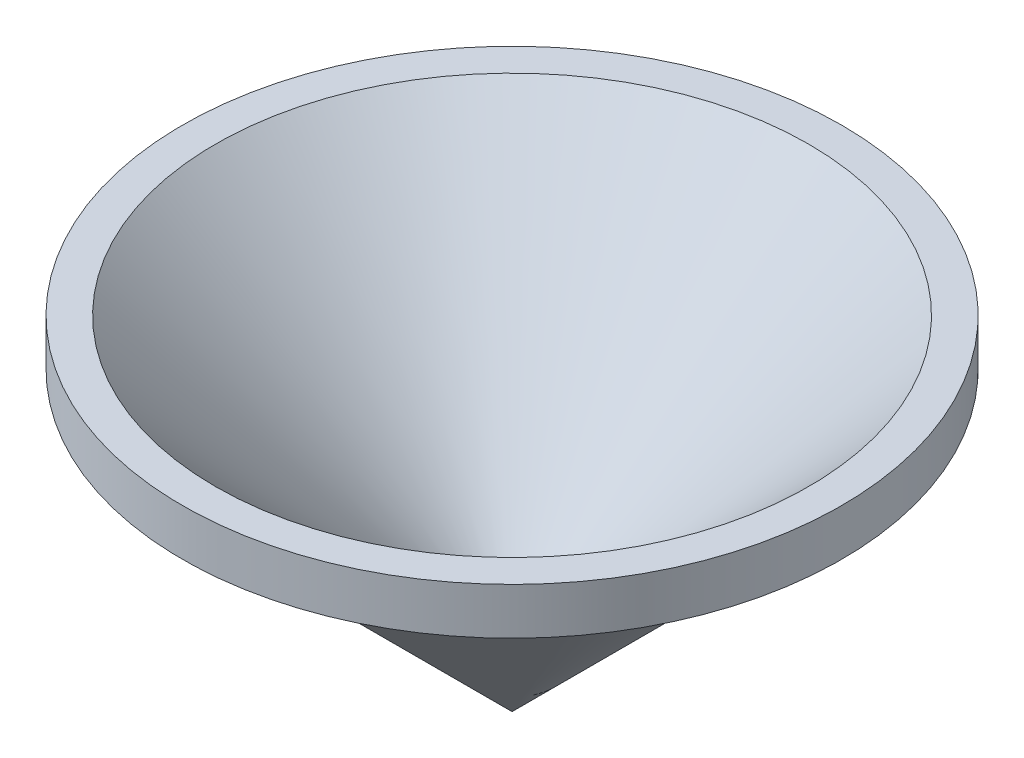
ISO-10303-21;
HEADER;
FILE_DESCRIPTION(('STEP AP214'),'2;1');
FILE_NAME('part.step','',(''),(''),'','','');
FILE_SCHEMA(('AUTOMOTIVE_DESIGN { 1 0 10303 214 1 1 1 1 }'));
ENDSEC;
DATA;
#1=APPLICATION_CONTEXT('core data for automotive mechanical design processes');
#2=APPLICATION_PROTOCOL_DEFINITION('international standard','automotive_design',2000,#1);
#3=PRODUCT_CONTEXT('',#1,'mechanical');
#4=PRODUCT('Part','Part','',(#3));
#5=PRODUCT_RELATED_PRODUCT_CATEGORY('part','',(#4));
#6=PRODUCT_DEFINITION_FORMATION('','',#4);
#7=PRODUCT_DEFINITION_CONTEXT('part definition',#1,'design');
#8=PRODUCT_DEFINITION('design','',#6,#7);
#9=PRODUCT_DEFINITION_SHAPE('','',#8);
#10=(LENGTH_UNIT() NAMED_UNIT(*) SI_UNIT(.MILLI.,.METRE.));
#11=(NAMED_UNIT(*) PLANE_ANGLE_UNIT() SI_UNIT($,.RADIAN.));
#12=(NAMED_UNIT(*) SI_UNIT($,.STERADIAN.) SOLID_ANGLE_UNIT());
#13=UNCERTAINTY_MEASURE_WITH_UNIT(LENGTH_MEASURE(1.E-05),#10,'distance_accuracy_value','');
#14=(GEOMETRIC_REPRESENTATION_CONTEXT(3) GLOBAL_UNCERTAINTY_ASSIGNED_CONTEXT((#13)) GLOBAL_UNIT_ASSIGNED_CONTEXT((#10,
#11,#12)) REPRESENTATION_CONTEXT('',''));
#15=CARTESIAN_POINT('',(0.,0.,0.));
#16=DIRECTION('',(0.,0.,1.));
#17=DIRECTION('',(1.,0.,0.));
#18=AXIS2_PLACEMENT_3D('',#15,#16,#17);
#19=CARTESIAN_POINT('',(0.,0.,0.));
#20=DIRECTION('',(0.,1.,0.));
#21=DIRECTION('',(0.,0.,1.));
#22=AXIS2_PLACEMENT_3D('',#19,#20,#21);
#23=CONICAL_SURFACE('',#22,0.,0.785398163397447);
#24=CARTESIAN_POINT('',(0.,18.0000000000001,0.));
#25=DIRECTION('',(0.,-1.,0.));
#26=DIRECTION('',(0.,0.,-1.));
#27=AXIS2_PLACEMENT_3D('',#24,#25,#26);
#28=CIRCLE('',#27,18.);
#29=CARTESIAN_POINT('',(0.,18.0000000000001,-18.));
#30=VERTEX_POINT('',#29);
#31=EDGE_CURVE('E11',#30,#30,#28,.T.);
#32=ORIENTED_EDGE('',*,*,#31,.T.);
#33=EDGE_LOOP('',(#32));
#34=FACE_BOUND('',#33,.T.);
#35=CARTESIAN_POINT('',(0.,0.,0.));
#36=VERTEX_POINT('',#35);
#37=VERTEX_LOOP('',#36);
#38=FACE_BOUND('',#37,.T.);
#39=ADVANCED_FACE('F37',(#34,#38),#23,.T.);
#40=CARTESIAN_POINT('',(18.,18.,0.));
#41=DIRECTION('',(0.,-1.,0.));
#42=DIRECTION('',(0.,0.,-1.));
#43=AXIS2_PLACEMENT_3D('',#40,#41,#42);
#44=PLANE('',#43);
#45=CARTESIAN_POINT('',(0.,18.,0.));
#46=DIRECTION('',(0.,-1.,0.));
#47=DIRECTION('',(0.,0.,-1.));
#48=AXIS2_PLACEMENT_3D('',#45,#46,#47);
#49=CIRCLE('',#48,20.);
#50=CARTESIAN_POINT('',(0.,18.,-20.));
#51=VERTEX_POINT('',#50);
#52=EDGE_CURVE('E44',#51,#51,#49,.T.);
#53=ORIENTED_EDGE('',*,*,#52,.T.);
#54=EDGE_LOOP('',(#53));
#55=FACE_BOUND('',#54,.T.);
#56=ORIENTED_EDGE('',*,*,#31,.F.);
#57=EDGE_LOOP('',(#56));
#58=FACE_BOUND('',#57,.T.);
#59=ADVANCED_FACE('F51',(#55,#58),#44,.T.);
#60=CARTESIAN_POINT('',(0.,0.,0.));
#61=DIRECTION('',(0.,-1.,0.));
#62=DIRECTION('',(0.,0.,-1.));
#63=AXIS2_PLACEMENT_3D('',#60,#61,#62);
#64=CYLINDRICAL_SURFACE('',#63,20.);
#65=CARTESIAN_POINT('',(0.,20.8284271247462,0.));
#66=DIRECTION('',(0.,-1.,0.));
#67=DIRECTION('',(0.,0.,-1.));
#68=AXIS2_PLACEMENT_3D('',#65,#66,#67);
#69=CIRCLE('',#68,20.);
#70=CARTESIAN_POINT('',(0.,20.8284271247462,-20.));
#71=VERTEX_POINT('',#70);
#72=EDGE_CURVE('E79',#71,#71,#69,.T.);
#73=ORIENTED_EDGE('',*,*,#72,.T.);
#74=EDGE_LOOP('',(#73));
#75=FACE_BOUND('',#74,.T.);
#76=ORIENTED_EDGE('',*,*,#52,.F.);
#77=EDGE_LOOP('',(#76));
#78=FACE_BOUND('',#77,.T.);
#79=ADVANCED_FACE('F56',(#75,#78),#64,.T.);
#80=CARTESIAN_POINT('',(20.,20.8284271247462,0.));
#81=DIRECTION('',(0.,1.,0.));
#82=DIRECTION('',(0.,0.,1.));
#83=AXIS2_PLACEMENT_3D('',#80,#81,#82);
#84=PLANE('',#83);
#85=CARTESIAN_POINT('',(0.,20.8284271247462,0.));
#86=DIRECTION('',(0.,-1.,0.));
#87=DIRECTION('',(0.,0.,-1.));
#88=AXIS2_PLACEMENT_3D('',#85,#86,#87);
#89=CIRCLE('',#88,18.);
#90=CARTESIAN_POINT('',(0.,20.8284271247462,-18.));
#91=VERTEX_POINT('',#90);
#92=EDGE_CURVE('E78',#91,#91,#89,.T.);
#93=ORIENTED_EDGE('',*,*,#92,.T.);
#94=EDGE_LOOP('',(#93));
#95=FACE_BOUND('',#94,.T.);
#96=ORIENTED_EDGE('',*,*,#72,.F.);
#97=EDGE_LOOP('',(#96));
#98=FACE_BOUND('',#97,.T.);
#99=ADVANCED_FACE('F63',(#95,#98),#84,.T.);
#100=CARTESIAN_POINT('',(0.,20.8284271247462,0.));
#101=DIRECTION('',(0.,1.,0.));
#102=DIRECTION('',(0.,0.,1.));
#103=AXIS2_PLACEMENT_3D('',#100,#101,#102);
#104=CONICAL_SURFACE('',#103,18.,0.785398163397448);
#105=CARTESIAN_POINT('',(0.,2.82842712474618,0.));
#106=VERTEX_POINT('',#105);
#107=VERTEX_LOOP('',#106);
#108=FACE_BOUND('',#107,.T.);
#109=ORIENTED_EDGE('',*,*,#92,.F.);
#110=EDGE_LOOP('',(#109));
#111=FACE_BOUND('',#110,.T.);
#112=ADVANCED_FACE('F70',(#108,#111),#104,.F.);
#113=CLOSED_SHELL('',(#39,#59,#79,#99,#112));
#114=MANIFOLD_SOLID_BREP('B2',#113);
#115=ADVANCED_BREP_SHAPE_REPRESENTATION('',(#18,#114),#14);
#116=SHAPE_DEFINITION_REPRESENTATION(#9,#115);
ENDSEC;
END-ISO-10303-21;
